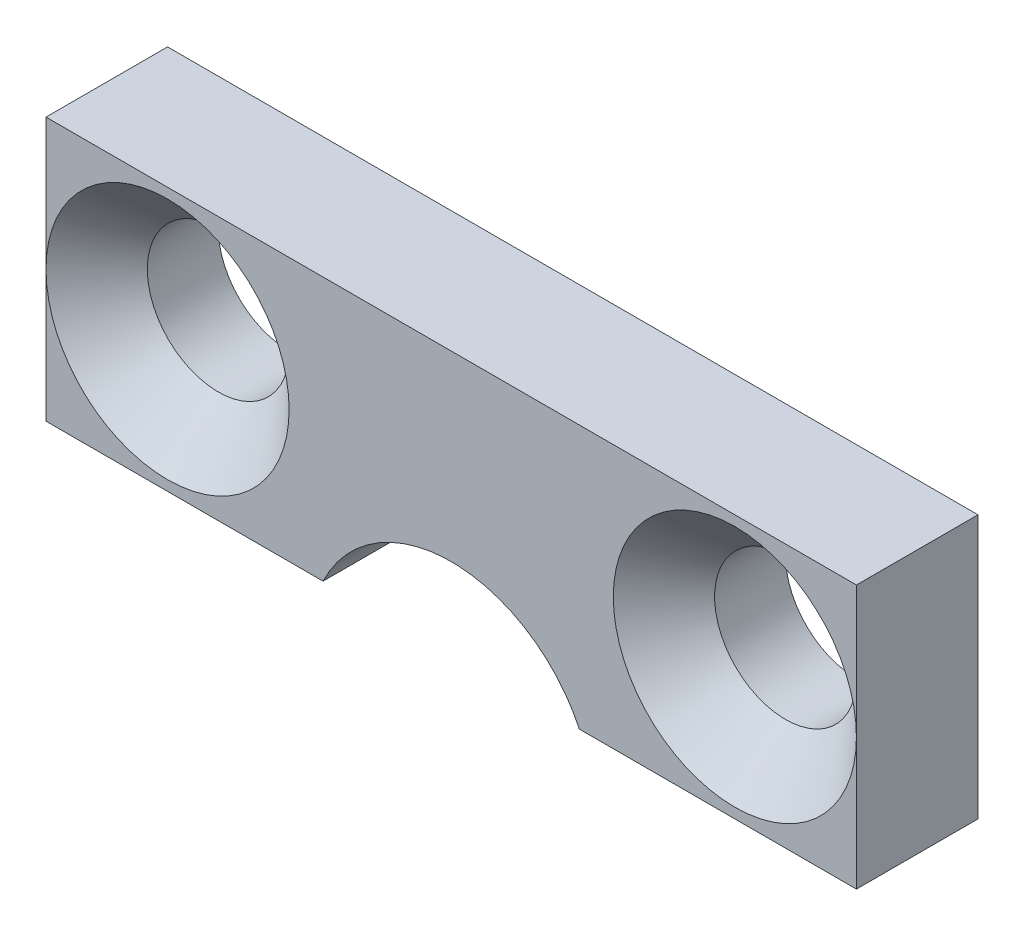
ISO-10303-21;
HEADER;
FILE_DESCRIPTION(('STEP AP214'),'2;1');
FILE_NAME('part.step','',(''),(''),'','','');
FILE_SCHEMA(('AUTOMOTIVE_DESIGN { 1 0 10303 214 1 1 1 1 }'));
ENDSEC;
DATA;
#1=APPLICATION_CONTEXT('core data for automotive mechanical design processes');
#2=APPLICATION_PROTOCOL_DEFINITION('international standard','automotive_design',2000,#1);
#3=PRODUCT_CONTEXT('',#1,'mechanical');
#4=PRODUCT('Part','Part','',(#3));
#5=PRODUCT_RELATED_PRODUCT_CATEGORY('part','',(#4));
#6=PRODUCT_DEFINITION_FORMATION('','',#4);
#7=PRODUCT_DEFINITION_CONTEXT('part definition',#1,'design');
#8=PRODUCT_DEFINITION('design','',#6,#7);
#9=PRODUCT_DEFINITION_SHAPE('','',#8);
#10=(LENGTH_UNIT() NAMED_UNIT(*) SI_UNIT(.MILLI.,.METRE.));
#11=(NAMED_UNIT(*) PLANE_ANGLE_UNIT() SI_UNIT($,.RADIAN.));
#12=(NAMED_UNIT(*) SI_UNIT($,.STERADIAN.) SOLID_ANGLE_UNIT());
#13=UNCERTAINTY_MEASURE_WITH_UNIT(LENGTH_MEASURE(1.E-05),#10,'distance_accuracy_value','');
#14=(GEOMETRIC_REPRESENTATION_CONTEXT(3) GLOBAL_UNCERTAINTY_ASSIGNED_CONTEXT((#13)) GLOBAL_UNIT_ASSIGNED_CONTEXT((#10,
#11,#12)) REPRESENTATION_CONTEXT('',''));
#15=CARTESIAN_POINT('',(0.,0.,0.));
#16=DIRECTION('',(0.,0.,1.));
#17=DIRECTION('',(1.,0.,0.));
#18=AXIS2_PLACEMENT_3D('',#15,#16,#17);
#19=CARTESIAN_POINT('',(-10.,-3.25,3.));
#20=DIRECTION('',(0.,1.,0.));
#21=DIRECTION('',(0.,0.,1.));
#22=AXIS2_PLACEMENT_3D('',#19,#20,#21);
#23=PLANE('',#22);
#24=DIRECTION('',(1.,0.,0.));
#25=VECTOR('',#24,1.);
#26=CARTESIAN_POINT('',(-10.,-3.25,0.));
#27=LINE('',#26,#25);
#28=CARTESIAN_POINT('',(-10.,-3.25,0.));
#29=VERTEX_POINT('',#28);
#30=CARTESIAN_POINT('',(-3.1622776601684,-3.25,0.));
#31=VERTEX_POINT('',#30);
#32=EDGE_CURVE('E95',#29,#31,#27,.T.);
#33=ORIENTED_EDGE('',*,*,#32,.T.);
#34=DIRECTION('',(0.,0.,1.));
#35=VECTOR('',#34,1.);
#36=CARTESIAN_POINT('',(-3.1622776601684,-3.25,0.));
#37=LINE('',#36,#35);
#38=CARTESIAN_POINT('',(-3.1622776601684,-3.25,3.));
#39=VERTEX_POINT('',#38);
#40=EDGE_CURVE('E32',#31,#39,#37,.T.);
#41=ORIENTED_EDGE('',*,*,#40,.T.);
#42=DIRECTION('',(1.,0.,0.));
#43=VECTOR('',#42,1.);
#44=CARTESIAN_POINT('',(-10.,-3.25,3.));
#45=LINE('',#44,#43);
#46=CARTESIAN_POINT('',(-10.,-3.25,3.));
#47=VERTEX_POINT('',#46);
#48=EDGE_CURVE('E106',#47,#39,#45,.T.);
#49=ORIENTED_EDGE('',*,*,#48,.F.);
#50=DIRECTION('',(0.,0.,-1.));
#51=VECTOR('',#50,1.);
#52=CARTESIAN_POINT('',(-10.,-3.25,3.));
#53=LINE('',#52,#51);
#54=EDGE_CURVE('E105',#47,#29,#53,.T.);
#55=ORIENTED_EDGE('',*,*,#54,.T.);
#56=EDGE_LOOP('',(#33,#41,#49,#55));
#57=FACE_BOUND('',#56,.T.);
#58=ADVANCED_FACE('F17',(#57),#23,.F.);
#59=CARTESIAN_POINT('',(10.,3.25,3.));
#60=DIRECTION('',(-1.,0.,0.));
#61=DIRECTION('',(0.,-1.,0.));
#62=AXIS2_PLACEMENT_3D('',#59,#60,#61);
#63=PLANE('',#62);
#64=DIRECTION('',(0.,1.,0.));
#65=VECTOR('',#64,1.);
#66=CARTESIAN_POINT('',(10.,3.25,0.));
#67=LINE('',#66,#65);
#68=CARTESIAN_POINT('',(10.,-3.25,0.));
#69=VERTEX_POINT('',#68);
#70=CARTESIAN_POINT('',(10.,3.25,0.));
#71=VERTEX_POINT('',#70);
#72=EDGE_CURVE('E94',#69,#71,#67,.T.);
#73=ORIENTED_EDGE('',*,*,#72,.T.);
#74=DIRECTION('',(0.,0.,-1.));
#75=VECTOR('',#74,1.);
#76=CARTESIAN_POINT('',(10.,3.25,3.));
#77=LINE('',#76,#75);
#78=CARTESIAN_POINT('',(10.,3.25,3.));
#79=VERTEX_POINT('',#78);
#80=EDGE_CURVE('E11',#79,#71,#77,.T.);
#81=ORIENTED_EDGE('',*,*,#80,.F.);
#82=DIRECTION('',(0.,1.,0.));
#83=VECTOR('',#82,1.);
#84=CARTESIAN_POINT('',(10.,3.25,3.));
#85=LINE('',#84,#83);
#86=CARTESIAN_POINT('',(10.,0.,3.));
#87=VERTEX_POINT('',#86);
#88=EDGE_CURVE('E98',#87,#79,#85,.T.);
#89=ORIENTED_EDGE('',*,*,#88,.F.);
#90=CARTESIAN_POINT('',(10.,-3.25,3.));
#91=VERTEX_POINT('',#90);
#92=EDGE_CURVE('E141',#91,#87,#85,.T.);
#93=ORIENTED_EDGE('',*,*,#92,.F.);
#94=DIRECTION('',(0.,0.,-1.));
#95=VECTOR('',#94,1.);
#96=CARTESIAN_POINT('',(10.,-3.25,3.));
#97=LINE('',#96,#95);
#98=EDGE_CURVE('E103',#91,#69,#97,.T.);
#99=ORIENTED_EDGE('',*,*,#98,.T.);
#100=EDGE_LOOP('',(#73,#81,#89,#93,#99));
#101=FACE_BOUND('',#100,.T.);
#102=ADVANCED_FACE('F19',(#101),#63,.F.);
#103=CARTESIAN_POINT('',(-10.,3.25,3.));
#104=DIRECTION('',(0.,-1.,0.));
#105=DIRECTION('',(0.,0.,-1.));
#106=AXIS2_PLACEMENT_3D('',#103,#104,#105);
#107=PLANE('',#106);
#108=DIRECTION('',(-1.,0.,0.));
#109=VECTOR('',#108,1.);
#110=CARTESIAN_POINT('',(-10.,3.25,0.));
#111=LINE('',#110,#109);
#112=CARTESIAN_POINT('',(-10.,3.25,0.));
#113=VERTEX_POINT('',#112);
#114=EDGE_CURVE('E99',#71,#113,#111,.T.);
#115=ORIENTED_EDGE('',*,*,#114,.T.);
#116=DIRECTION('',(0.,0.,-1.));
#117=VECTOR('',#116,1.);
#118=CARTESIAN_POINT('',(-10.,3.25,3.));
#119=LINE('',#118,#117);
#120=CARTESIAN_POINT('',(-10.,3.25,3.));
#121=VERTEX_POINT('',#120);
#122=EDGE_CURVE('E25',#121,#113,#119,.T.);
#123=ORIENTED_EDGE('',*,*,#122,.F.);
#124=DIRECTION('',(-1.,0.,0.));
#125=VECTOR('',#124,1.);
#126=CARTESIAN_POINT('',(-10.,3.25,3.));
#127=LINE('',#126,#125);
#128=EDGE_CURVE('E126',#79,#121,#127,.T.);
#129=ORIENTED_EDGE('',*,*,#128,.F.);
#130=ORIENTED_EDGE('',*,*,#80,.T.);
#131=EDGE_LOOP('',(#115,#123,#129,#130));
#132=FACE_BOUND('',#131,.T.);
#133=ADVANCED_FACE('F135',(#132),#107,.F.);
#134=CARTESIAN_POINT('',(-10.,3.25,3.));
#135=DIRECTION('',(1.,0.,0.));
#136=DIRECTION('',(0.,1.,0.));
#137=AXIS2_PLACEMENT_3D('',#134,#135,#136);
#138=PLANE('',#137);
#139=DIRECTION('',(0.,-1.,0.));
#140=VECTOR('',#139,1.);
#141=CARTESIAN_POINT('',(-10.,3.25,0.));
#142=LINE('',#141,#140);
#143=EDGE_CURVE('E96',#113,#29,#142,.T.);
#144=ORIENTED_EDGE('',*,*,#143,.T.);
#145=ORIENTED_EDGE('',*,*,#54,.F.);
#146=DIRECTION('',(0.,-1.,0.));
#147=VECTOR('',#146,1.);
#148=CARTESIAN_POINT('',(-10.,3.25,3.));
#149=LINE('',#148,#147);
#150=CARTESIAN_POINT('',(-10.,0.,3.));
#151=VERTEX_POINT('',#150);
#152=EDGE_CURVE('E123',#151,#47,#149,.T.);
#153=ORIENTED_EDGE('',*,*,#152,.F.);
#154=EDGE_CURVE('E117',#121,#151,#149,.T.);
#155=ORIENTED_EDGE('',*,*,#154,.F.);
#156=ORIENTED_EDGE('',*,*,#122,.T.);
#157=EDGE_LOOP('',(#144,#145,#153,#155,#156));
#158=FACE_BOUND('',#157,.T.);
#159=ADVANCED_FACE('F113',(#158),#138,.F.);
#160=CARTESIAN_POINT('',(3.16227766016838,-3.25,3.));
#161=VERTEX_POINT('',#160);
#162=EDGE_CURVE('E89',#161,#91,#45,.T.);
#163=ORIENTED_EDGE('',*,*,#162,.F.);
#164=DIRECTION('',(0.,0.,1.));
#165=VECTOR('',#164,1.);
#166=CARTESIAN_POINT('',(3.16227766016838,-3.25,0.));
#167=LINE('',#166,#165);
#168=CARTESIAN_POINT('',(3.16227766016838,-3.25,0.));
#169=VERTEX_POINT('',#168);
#170=EDGE_CURVE('E75',#161,#169,#167,.F.);
#171=ORIENTED_EDGE('',*,*,#170,.T.);
#172=EDGE_CURVE('E87',#169,#69,#27,.T.);
#173=ORIENTED_EDGE('',*,*,#172,.T.);
#174=ORIENTED_EDGE('',*,*,#98,.F.);
#175=EDGE_LOOP('',(#163,#171,#173,#174));
#176=FACE_BOUND('',#175,.T.);
#177=ADVANCED_FACE('F85',(#176),#23,.F.);
#178=CARTESIAN_POINT('',(0.,0.,3.));
#179=DIRECTION('',(0.,0.,1.));
#180=DIRECTION('',(1.,0.,0.));
#181=AXIS2_PLACEMENT_3D('',#178,#179,#180);
#182=PLANE('',#181);
#183=CARTESIAN_POINT('',(0.,-4.75,3.));
#184=DIRECTION('',(0.,0.,1.));
#185=DIRECTION('',(1.,0.,0.));
#186=AXIS2_PLACEMENT_3D('',#183,#184,#185);
#187=CIRCLE('',#186,3.5);
#188=EDGE_CURVE('E81',#161,#39,#187,.T.);
#189=ORIENTED_EDGE('',*,*,#188,.F.);
#190=ORIENTED_EDGE('',*,*,#162,.T.);
#191=ORIENTED_EDGE('',*,*,#92,.T.);
#192=CARTESIAN_POINT('',(7.,0.,3.));
#193=DIRECTION('',(0.,0.,1.));
#194=DIRECTION('',(1.,0.,0.));
#195=AXIS2_PLACEMENT_3D('',#192,#193,#194);
#196=CIRCLE('',#195,3.);
#197=EDGE_CURVE('E38',#87,#87,#196,.T.);
#198=ORIENTED_EDGE('',*,*,#197,.F.);
#199=ORIENTED_EDGE('',*,*,#88,.T.);
#200=ORIENTED_EDGE('',*,*,#128,.T.);
#201=ORIENTED_EDGE('',*,*,#154,.T.);
#202=CARTESIAN_POINT('',(-7.,0.,3.));
#203=DIRECTION('',(0.,0.,1.));
#204=DIRECTION('',(1.,0.,0.));
#205=AXIS2_PLACEMENT_3D('',#202,#203,#204);
#206=CIRCLE('',#205,3.);
#207=EDGE_CURVE('E129',#151,#151,#206,.T.);
#208=ORIENTED_EDGE('',*,*,#207,.F.);
#209=ORIENTED_EDGE('',*,*,#152,.T.);
#210=ORIENTED_EDGE('',*,*,#48,.T.);
#211=EDGE_LOOP('',(#189,#190,#191,#198,#199,#200,#201,#208,#209,#210));
#212=FACE_BOUND('',#211,.T.);
#213=ADVANCED_FACE('F128',(#212),#182,.T.);
#214=CARTESIAN_POINT('',(0.,0.,0.));
#215=DIRECTION('',(0.,0.,1.));
#216=DIRECTION('',(1.,0.,0.));
#217=AXIS2_PLACEMENT_3D('',#214,#215,#216);
#218=PLANE('',#217);
#219=CARTESIAN_POINT('',(7.,0.,0.));
#220=DIRECTION('',(0.,0.,1.));
#221=DIRECTION('',(1.,0.,0.));
#222=AXIS2_PLACEMENT_3D('',#219,#220,#221);
#223=CIRCLE('',#222,1.75);
#224=CARTESIAN_POINT('',(8.75,0.,0.));
#225=VERTEX_POINT('',#224);
#226=EDGE_CURVE('E149',#225,#225,#223,.T.);
#227=ORIENTED_EDGE('',*,*,#226,.T.);
#228=EDGE_LOOP('',(#227));
#229=FACE_BOUND('',#228,.T.);
#230=CARTESIAN_POINT('',(-7.,0.,0.));
#231=DIRECTION('',(0.,0.,1.));
#232=DIRECTION('',(1.,0.,0.));
#233=AXIS2_PLACEMENT_3D('',#230,#231,#232);
#234=CIRCLE('',#233,1.75);
#235=CARTESIAN_POINT('',(-5.25,0.,0.));
#236=VERTEX_POINT('',#235);
#237=EDGE_CURVE('E134',#236,#236,#234,.T.);
#238=ORIENTED_EDGE('',*,*,#237,.T.);
#239=EDGE_LOOP('',(#238));
#240=FACE_BOUND('',#239,.T.);
#241=ORIENTED_EDGE('',*,*,#172,.F.);
#242=CARTESIAN_POINT('',(0.,-4.75,0.));
#243=DIRECTION('',(0.,0.,1.));
#244=DIRECTION('',(1.,0.,0.));
#245=AXIS2_PLACEMENT_3D('',#242,#243,#244);
#246=CIRCLE('',#245,3.5);
#247=EDGE_CURVE('E72',#169,#31,#246,.T.);
#248=ORIENTED_EDGE('',*,*,#247,.T.);
#249=ORIENTED_EDGE('',*,*,#32,.F.);
#250=ORIENTED_EDGE('',*,*,#143,.F.);
#251=ORIENTED_EDGE('',*,*,#114,.F.);
#252=ORIENTED_EDGE('',*,*,#72,.F.);
#253=EDGE_LOOP('',(#241,#248,#249,#250,#251,#252));
#254=FACE_BOUND('',#253,.T.);
#255=ADVANCED_FACE('F92',(#229,#240,#254),#218,.F.);
#256=CARTESIAN_POINT('',(-7.,0.,3.));
#257=DIRECTION('',(0.,0.,1.));
#258=DIRECTION('',(1.,0.,0.));
#259=AXIS2_PLACEMENT_3D('',#256,#257,#258);
#260=CYLINDRICAL_SURFACE('',#259,1.75);
#261=ORIENTED_EDGE('',*,*,#237,.F.);
#262=EDGE_LOOP('',(#261));
#263=FACE_BOUND('',#262,.T.);
#264=CARTESIAN_POINT('',(-7.,0.,1.75));
#265=DIRECTION('',(0.,0.,1.));
#266=DIRECTION('',(1.,0.,0.));
#267=AXIS2_PLACEMENT_3D('',#264,#265,#266);
#268=CIRCLE('',#267,1.75);
#269=CARTESIAN_POINT('',(-5.25,0.,1.75));
#270=VERTEX_POINT('',#269);
#271=EDGE_CURVE('E145',#270,#270,#268,.T.);
#272=ORIENTED_EDGE('',*,*,#271,.T.);
#273=EDGE_LOOP('',(#272));
#274=FACE_BOUND('',#273,.T.);
#275=ADVANCED_FACE('F235',(#263,#274),#260,.F.);
#276=CARTESIAN_POINT('',(-7.,0.,3.));
#277=DIRECTION('',(0.,0.,1.));
#278=DIRECTION('',(1.,0.,0.));
#279=AXIS2_PLACEMENT_3D('',#276,#277,#278);
#280=CONICAL_SURFACE('',#279,3.,0.785398163397449);
#281=ORIENTED_EDGE('',*,*,#271,.F.);
#282=EDGE_LOOP('',(#281));
#283=FACE_BOUND('',#282,.T.);
#284=ORIENTED_EDGE('',*,*,#207,.T.);
#285=EDGE_LOOP('',(#284));
#286=FACE_BOUND('',#285,.T.);
#287=ADVANCED_FACE('F171',(#283,#286),#280,.F.);
#288=CARTESIAN_POINT('',(7.,0.,3.));
#289=DIRECTION('',(0.,0.,1.));
#290=DIRECTION('',(1.,0.,0.));
#291=AXIS2_PLACEMENT_3D('',#288,#289,#290);
#292=CYLINDRICAL_SURFACE('',#291,1.75);
#293=ORIENTED_EDGE('',*,*,#226,.F.);
#294=EDGE_LOOP('',(#293));
#295=FACE_BOUND('',#294,.T.);
#296=CARTESIAN_POINT('',(7.,0.,1.75));
#297=DIRECTION('',(0.,0.,1.));
#298=DIRECTION('',(1.,0.,0.));
#299=AXIS2_PLACEMENT_3D('',#296,#297,#298);
#300=CIRCLE('',#299,1.75);
#301=CARTESIAN_POINT('',(8.75,0.,1.75));
#302=VERTEX_POINT('',#301);
#303=EDGE_CURVE('E152',#302,#302,#300,.T.);
#304=ORIENTED_EDGE('',*,*,#303,.T.);
#305=EDGE_LOOP('',(#304));
#306=FACE_BOUND('',#305,.T.);
#307=ADVANCED_FACE('F159',(#295,#306),#292,.F.);
#308=CARTESIAN_POINT('',(7.,0.,3.));
#309=DIRECTION('',(0.,0.,1.));
#310=DIRECTION('',(1.,0.,0.));
#311=AXIS2_PLACEMENT_3D('',#308,#309,#310);
#312=CONICAL_SURFACE('',#311,3.,0.785398163397449);
#313=ORIENTED_EDGE('',*,*,#303,.F.);
#314=EDGE_LOOP('',(#313));
#315=FACE_BOUND('',#314,.T.);
#316=ORIENTED_EDGE('',*,*,#197,.T.);
#317=EDGE_LOOP('',(#316));
#318=FACE_BOUND('',#317,.T.);
#319=ADVANCED_FACE('F161',(#315,#318),#312,.F.);
#320=CARTESIAN_POINT('',(0.,-4.75,0.));
#321=DIRECTION('',(0.,0.,1.));
#322=DIRECTION('',(1.,0.,0.));
#323=AXIS2_PLACEMENT_3D('',#320,#321,#322);
#324=CYLINDRICAL_SURFACE('',#323,3.5);
#325=ORIENTED_EDGE('',*,*,#247,.F.);
#326=ORIENTED_EDGE('',*,*,#170,.F.);
#327=ORIENTED_EDGE('',*,*,#188,.T.);
#328=ORIENTED_EDGE('',*,*,#40,.F.);
#329=EDGE_LOOP('',(#325,#326,#327,#328));
#330=FACE_BOUND('',#329,.T.);
#331=ADVANCED_FACE('F74',(#330),#324,.F.);
#332=CLOSED_SHELL('',(#58,#102,#133,#159,#177,#213,#255,#275,#287,#307,#319,#331));
#333=MANIFOLD_SOLID_BREP('B1',#332);
#334=ADVANCED_BREP_SHAPE_REPRESENTATION('',(#18,#333),#14);
#335=SHAPE_DEFINITION_REPRESENTATION(#9,#334);
ENDSEC;
END-ISO-10303-21;
